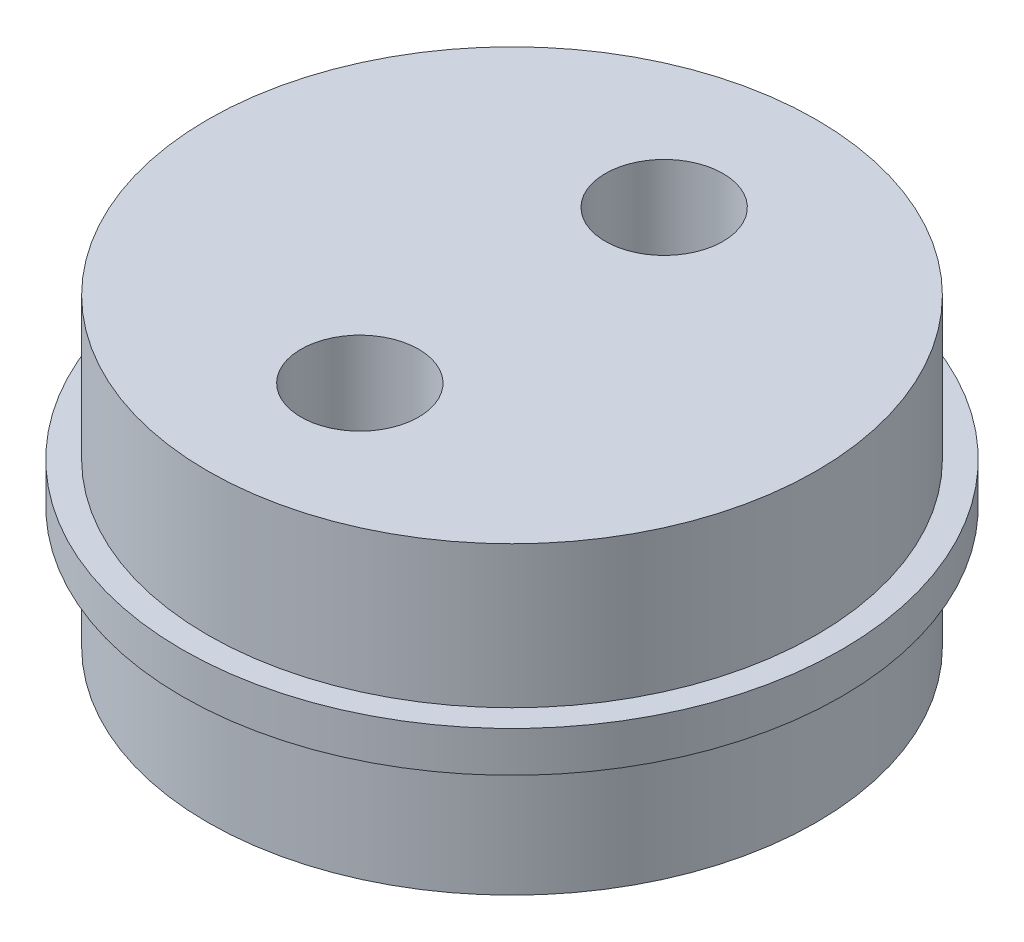
ISO-10303-21;
HEADER;
FILE_DESCRIPTION(('STEP AP214'),'2;1');
FILE_NAME('part.step','',(''),(''),'','','');
FILE_SCHEMA(('AUTOMOTIVE_DESIGN { 1 0 10303 214 1 1 1 1 }'));
ENDSEC;
DATA;
#1=APPLICATION_CONTEXT('core data for automotive mechanical design processes');
#2=APPLICATION_PROTOCOL_DEFINITION('international standard','automotive_design',2000,#1);
#3=PRODUCT_CONTEXT('',#1,'mechanical');
#4=PRODUCT('Part','Part','',(#3));
#5=PRODUCT_RELATED_PRODUCT_CATEGORY('part','',(#4));
#6=PRODUCT_DEFINITION_FORMATION('','',#4);
#7=PRODUCT_DEFINITION_CONTEXT('part definition',#1,'design');
#8=PRODUCT_DEFINITION('design','',#6,#7);
#9=PRODUCT_DEFINITION_SHAPE('','',#8);
#10=(LENGTH_UNIT() NAMED_UNIT(*) SI_UNIT(.MILLI.,.METRE.));
#11=(NAMED_UNIT(*) PLANE_ANGLE_UNIT() SI_UNIT($,.RADIAN.));
#12=(NAMED_UNIT(*) SI_UNIT($,.STERADIAN.) SOLID_ANGLE_UNIT());
#13=UNCERTAINTY_MEASURE_WITH_UNIT(LENGTH_MEASURE(1.E-05),#10,'distance_accuracy_value','');
#14=(GEOMETRIC_REPRESENTATION_CONTEXT(3) GLOBAL_UNCERTAINTY_ASSIGNED_CONTEXT((#13)) GLOBAL_UNIT_ASSIGNED_CONTEXT((#10,
#11,#12)) REPRESENTATION_CONTEXT('',''));
#15=CARTESIAN_POINT('',(0.,0.,0.));
#16=DIRECTION('',(0.,0.,1.));
#17=DIRECTION('',(1.,0.,0.));
#18=AXIS2_PLACEMENT_3D('',#15,#16,#17);
#19=CARTESIAN_POINT('',(0.,2.,0.));
#20=DIRECTION('',(0.,-1.,0.));
#21=DIRECTION('',(0.,0.,-1.));
#22=AXIS2_PLACEMENT_3D('',#19,#20,#21);
#23=CYLINDRICAL_SURFACE('',#22,16.25);
#24=CARTESIAN_POINT('',(0.,2.,0.));
#25=DIRECTION('',(0.,1.,0.));
#26=DIRECTION('',(0.,0.,1.));
#27=AXIS2_PLACEMENT_3D('',#24,#25,#26);
#28=CIRCLE('',#27,16.25);
#29=CARTESIAN_POINT('',(0.,2.,16.25));
#30=VERTEX_POINT('',#29);
#31=EDGE_CURVE('E57',#30,#30,#28,.T.);
#32=ORIENTED_EDGE('',*,*,#31,.F.);
#33=EDGE_LOOP('',(#32));
#34=FACE_BOUND('',#33,.T.);
#35=CARTESIAN_POINT('',(0.,0.,0.));
#36=DIRECTION('',(0.,1.,0.));
#37=DIRECTION('',(0.,0.,1.));
#38=AXIS2_PLACEMENT_3D('',#35,#36,#37);
#39=CIRCLE('',#38,16.25);
#40=CARTESIAN_POINT('',(0.,0.,16.25));
#41=VERTEX_POINT('',#40);
#42=EDGE_CURVE('E66',#41,#41,#39,.T.);
#43=ORIENTED_EDGE('',*,*,#42,.T.);
#44=EDGE_LOOP('',(#43));
#45=FACE_BOUND('',#44,.T.);
#46=ADVANCED_FACE('F43',(#34,#45),#23,.T.);
#47=CARTESIAN_POINT('',(0.,2.,0.));
#48=DIRECTION('',(0.,1.,0.));
#49=DIRECTION('',(0.,0.,1.));
#50=AXIS2_PLACEMENT_3D('',#47,#48,#49);
#51=PLANE('',#50);
#52=CARTESIAN_POINT('',(0.,2.,0.));
#53=DIRECTION('',(0.,1.,0.));
#54=DIRECTION('',(0.,0.,1.));
#55=AXIS2_PLACEMENT_3D('',#52,#53,#54);
#56=CIRCLE('',#55,15.);
#57=CARTESIAN_POINT('',(0.,2.,15.));
#58=VERTEX_POINT('',#57);
#59=EDGE_CURVE('E10',#58,#58,#56,.T.);
#60=ORIENTED_EDGE('',*,*,#59,.F.);
#61=EDGE_LOOP('',(#60));
#62=FACE_BOUND('',#61,.T.);
#63=ORIENTED_EDGE('',*,*,#31,.T.);
#64=EDGE_LOOP('',(#63));
#65=FACE_BOUND('',#64,.T.);
#66=ADVANCED_FACE('F128',(#62,#65),#51,.T.);
#67=CARTESIAN_POINT('',(0.,0.,0.));
#68=DIRECTION('',(0.,1.,0.));
#69=DIRECTION('',(0.,0.,1.));
#70=AXIS2_PLACEMENT_3D('',#67,#68,#69);
#71=PLANE('',#70);
#72=CARTESIAN_POINT('',(0.,0.,0.));
#73=DIRECTION('',(0.,-1.,0.));
#74=DIRECTION('',(0.,0.,-1.));
#75=AXIS2_PLACEMENT_3D('',#72,#73,#74);
#76=CIRCLE('',#75,15.);
#77=CARTESIAN_POINT('',(0.,0.,-15.));
#78=VERTEX_POINT('',#77);
#79=EDGE_CURVE('E51',#78,#78,#76,.T.);
#80=ORIENTED_EDGE('',*,*,#79,.F.);
#81=EDGE_LOOP('',(#80));
#82=FACE_BOUND('',#81,.T.);
#83=ORIENTED_EDGE('',*,*,#42,.F.);
#84=EDGE_LOOP('',(#83));
#85=FACE_BOUND('',#84,.T.);
#86=ADVANCED_FACE('F134',(#82,#85),#71,.F.);
#87=CARTESIAN_POINT('',(0.,-6.,0.));
#88=DIRECTION('',(0.,1.,0.));
#89=DIRECTION('',(0.,0.,1.));
#90=AXIS2_PLACEMENT_3D('',#87,#88,#89);
#91=CYLINDRICAL_SURFACE('',#90,15.);
#92=CARTESIAN_POINT('',(0.,-6.,0.));
#93=DIRECTION('',(0.,-1.,0.));
#94=DIRECTION('',(0.,0.,-1.));
#95=AXIS2_PLACEMENT_3D('',#92,#93,#94);
#96=CIRCLE('',#95,15.);
#97=CARTESIAN_POINT('',(0.,-6.,-15.));
#98=VERTEX_POINT('',#97);
#99=EDGE_CURVE('E63',#98,#98,#96,.T.);
#100=ORIENTED_EDGE('',*,*,#99,.F.);
#101=EDGE_LOOP('',(#100));
#102=FACE_BOUND('',#101,.T.);
#103=ORIENTED_EDGE('',*,*,#79,.T.);
#104=EDGE_LOOP('',(#103));
#105=FACE_BOUND('',#104,.T.);
#106=ADVANCED_FACE('F141',(#102,#105),#91,.T.);
#107=CARTESIAN_POINT('',(0.,-6.,0.));
#108=DIRECTION('',(0.,-1.,0.));
#109=DIRECTION('',(0.,0.,-1.));
#110=AXIS2_PLACEMENT_3D('',#107,#108,#109);
#111=PLANE('',#110);
#112=CARTESIAN_POINT('',(0.,-6.,-7.5));
#113=DIRECTION('',(0.,1.,0.));
#114=DIRECTION('',(0.,0.,1.));
#115=AXIS2_PLACEMENT_3D('',#112,#113,#114);
#116=CIRCLE('',#115,2.2);
#117=CARTESIAN_POINT('',(0.,-6.,-5.3));
#118=VERTEX_POINT('',#117);
#119=EDGE_CURVE('E85',#118,#118,#116,.T.);
#120=ORIENTED_EDGE('',*,*,#119,.T.);
#121=EDGE_LOOP('',(#120));
#122=FACE_BOUND('',#121,.T.);
#123=CARTESIAN_POINT('',(0.,-6.,7.5));
#124=DIRECTION('',(0.,1.,0.));
#125=DIRECTION('',(0.,0.,1.));
#126=AXIS2_PLACEMENT_3D('',#123,#124,#125);
#127=CIRCLE('',#126,2.2);
#128=CARTESIAN_POINT('',(0.,-6.,9.7));
#129=VERTEX_POINT('',#128);
#130=EDGE_CURVE('E93',#129,#129,#127,.T.);
#131=ORIENTED_EDGE('',*,*,#130,.T.);
#132=EDGE_LOOP('',(#131));
#133=FACE_BOUND('',#132,.T.);
#134=ORIENTED_EDGE('',*,*,#99,.T.);
#135=EDGE_LOOP('',(#134));
#136=FACE_BOUND('',#135,.T.);
#137=ADVANCED_FACE('F146',(#122,#133,#136),#111,.T.);
#138=CARTESIAN_POINT('',(0.,9.,0.));
#139=DIRECTION('',(0.,-1.,0.));
#140=DIRECTION('',(0.,0.,-1.));
#141=AXIS2_PLACEMENT_3D('',#138,#139,#140);
#142=CYLINDRICAL_SURFACE('',#141,15.);
#143=CARTESIAN_POINT('',(0.,9.,0.));
#144=DIRECTION('',(0.,1.,0.));
#145=DIRECTION('',(0.,0.,1.));
#146=AXIS2_PLACEMENT_3D('',#143,#144,#145);
#147=CIRCLE('',#146,15.);
#148=CARTESIAN_POINT('',(0.,9.,15.));
#149=VERTEX_POINT('',#148);
#150=EDGE_CURVE('E61',#149,#149,#147,.T.);
#151=ORIENTED_EDGE('',*,*,#150,.F.);
#152=EDGE_LOOP('',(#151));
#153=FACE_BOUND('',#152,.T.);
#154=ORIENTED_EDGE('',*,*,#59,.T.);
#155=EDGE_LOOP('',(#154));
#156=FACE_BOUND('',#155,.T.);
#157=ADVANCED_FACE('F122',(#153,#156),#142,.T.);
#158=CARTESIAN_POINT('',(0.,9.,0.));
#159=DIRECTION('',(0.,1.,0.));
#160=DIRECTION('',(0.,0.,1.));
#161=AXIS2_PLACEMENT_3D('',#158,#159,#160);
#162=PLANE('',#161);
#163=CARTESIAN_POINT('',(0.,9.,-7.5));
#164=DIRECTION('',(0.,1.,0.));
#165=DIRECTION('',(0.,0.,1.));
#166=AXIS2_PLACEMENT_3D('',#163,#164,#165);
#167=CIRCLE('',#166,2.9);
#168=CARTESIAN_POINT('',(0.,9.,-10.4));
#169=VERTEX_POINT('',#168);
#170=EDGE_CURVE('E78',#169,#169,#167,.F.);
#171=ORIENTED_EDGE('',*,*,#170,.T.);
#172=EDGE_LOOP('',(#171));
#173=FACE_BOUND('',#172,.T.);
#174=CARTESIAN_POINT('',(0.,9.,7.5));
#175=DIRECTION('',(0.,1.,0.));
#176=DIRECTION('',(0.,0.,1.));
#177=AXIS2_PLACEMENT_3D('',#174,#175,#176);
#178=CIRCLE('',#177,2.9);
#179=CARTESIAN_POINT('',(0.,9.,4.6));
#180=VERTEX_POINT('',#179);
#181=EDGE_CURVE('E74',#180,#180,#178,.F.);
#182=ORIENTED_EDGE('',*,*,#181,.T.);
#183=EDGE_LOOP('',(#182));
#184=FACE_BOUND('',#183,.T.);
#185=ORIENTED_EDGE('',*,*,#150,.T.);
#186=EDGE_LOOP('',(#185));
#187=FACE_BOUND('',#186,.T.);
#188=ADVANCED_FACE('F111',(#173,#184,#187),#162,.T.);
#189=CARTESIAN_POINT('',(0.,9.000012,7.5));
#190=DIRECTION('',(0.,-1.,0.));
#191=DIRECTION('',(0.,0.,-1.));
#192=AXIS2_PLACEMENT_3D('',#189,#190,#191);
#193=CYLINDRICAL_SURFACE('',#192,2.9);
#194=CARTESIAN_POINT('',(0.,1.,7.5));
#195=DIRECTION('',(0.,1.,0.));
#196=DIRECTION('',(0.,0.,-1.));
#197=AXIS2_PLACEMENT_3D('',#194,#195,#196);
#198=CIRCLE('',#197,2.9);
#199=CARTESIAN_POINT('',(0.,0.999999999999999,4.6));
#200=VERTEX_POINT('',#199);
#201=EDGE_CURVE('E91',#200,#200,#198,.T.);
#202=CARTESIAN_POINT('',(0.,9.,4.6));
#203=CARTESIAN_POINT('',(0.,8.91666666666667,4.6));
#204=CARTESIAN_POINT('',(0.,8.83333333333333,4.6));
#205=CARTESIAN_POINT('',(0.,8.66666666666667,4.6));
#206=CARTESIAN_POINT('',(0.,8.58333333333333,4.6));
#207=CARTESIAN_POINT('',(0.,8.41666666666667,4.6));
#208=CARTESIAN_POINT('',(0.,8.33333333333333,4.6));
#209=CARTESIAN_POINT('',(0.,8.16666666666667,4.6));
#210=CARTESIAN_POINT('',(0.,8.08333333333333,4.6));
#211=CARTESIAN_POINT('',(0.,7.91666666666667,4.6));
#212=CARTESIAN_POINT('',(0.,7.83333333333333,4.6));
#213=CARTESIAN_POINT('',(0.,7.66666666666667,4.6));
#214=CARTESIAN_POINT('',(0.,7.58333333333333,4.6));
#215=CARTESIAN_POINT('',(0.,7.41666666666667,4.6));
#216=CARTESIAN_POINT('',(0.,7.33333333333333,4.6));
#217=CARTESIAN_POINT('',(0.,7.16666666666667,4.6));
#218=CARTESIAN_POINT('',(0.,7.08333333333333,4.6));
#219=CARTESIAN_POINT('',(0.,6.91666666666667,4.6));
#220=CARTESIAN_POINT('',(0.,6.83333333333333,4.6));
#221=CARTESIAN_POINT('',(0.,6.66666666666667,4.6));
#222=CARTESIAN_POINT('',(0.,6.58333333333333,4.6));
#223=CARTESIAN_POINT('',(0.,6.41666666666667,4.6));
#224=CARTESIAN_POINT('',(0.,6.33333333333333,4.6));
#225=CARTESIAN_POINT('',(0.,6.16666666666667,4.6));
#226=CARTESIAN_POINT('',(0.,6.08333333333333,4.6));
#227=CARTESIAN_POINT('',(0.,5.91666666666667,4.6));
#228=CARTESIAN_POINT('',(0.,5.83333333333333,4.6));
#229=CARTESIAN_POINT('',(0.,5.66666666666667,4.6));
#230=CARTESIAN_POINT('',(0.,5.58333333333333,4.6));
#231=CARTESIAN_POINT('',(0.,5.41666666666667,4.6));
#232=CARTESIAN_POINT('',(0.,5.33333333333333,4.6));
#233=CARTESIAN_POINT('',(0.,5.16666666666667,4.6));
#234=CARTESIAN_POINT('',(0.,5.08333333333333,4.6));
#235=CARTESIAN_POINT('',(0.,4.91666666666667,4.6));
#236=CARTESIAN_POINT('',(0.,4.83333333333333,4.6));
#237=CARTESIAN_POINT('',(0.,4.66666666666667,4.6));
#238=CARTESIAN_POINT('',(0.,4.58333333333333,4.6));
#239=CARTESIAN_POINT('',(0.,4.41666666666667,4.6));
#240=CARTESIAN_POINT('',(0.,4.33333333333333,4.6));
#241=CARTESIAN_POINT('',(0.,4.16666666666667,4.6));
#242=CARTESIAN_POINT('',(0.,4.08333333333333,4.6));
#243=CARTESIAN_POINT('',(0.,3.91666666666667,4.6));
#244=CARTESIAN_POINT('',(0.,3.83333333333333,4.6));
#245=CARTESIAN_POINT('',(0.,3.66666666666667,4.6));
#246=CARTESIAN_POINT('',(0.,3.58333333333333,4.6));
#247=CARTESIAN_POINT('',(0.,3.41666666666667,4.6));
#248=CARTESIAN_POINT('',(0.,3.33333333333333,4.6));
#249=CARTESIAN_POINT('',(0.,3.16666666666667,4.6));
#250=CARTESIAN_POINT('',(0.,3.08333333333333,4.6));
#251=CARTESIAN_POINT('',(0.,2.91666666666667,4.6));
#252=CARTESIAN_POINT('',(0.,2.83333333333333,4.6));
#253=CARTESIAN_POINT('',(0.,2.66666666666667,4.6));
#254=CARTESIAN_POINT('',(0.,2.58333333333333,4.6));
#255=CARTESIAN_POINT('',(0.,2.41666666666667,4.6));
#256=CARTESIAN_POINT('',(0.,2.33333333333333,4.6));
#257=CARTESIAN_POINT('',(0.,2.16666666666667,4.6));
#258=CARTESIAN_POINT('',(0.,2.08333333333333,4.6));
#259=CARTESIAN_POINT('',(0.,1.91666666666667,4.6));
#260=CARTESIAN_POINT('',(0.,1.83333333333333,4.6));
#261=CARTESIAN_POINT('',(0.,1.66666666666667,4.6));
#262=CARTESIAN_POINT('',(0.,1.58333333333333,4.6));
#263=CARTESIAN_POINT('',(0.,1.41666666666667,4.6));
#264=CARTESIAN_POINT('',(0.,1.33333333333333,4.6));
#265=CARTESIAN_POINT('',(0.,1.16666666666667,4.6));
#266=CARTESIAN_POINT('',(0.,1.08333333333333,4.6));
#267=CARTESIAN_POINT('',(0.,0.999999999999999,4.6));
#268=B_SPLINE_CURVE_WITH_KNOTS('',3,(#202,#203,#204,#205,#206,#207,#208,#209,#210,#211,#212,
#213,#214,#215,#216,#217,#218,#219,#220,#221,#222,#223,#224,#225,#226,#227,#228,#229,#230,#231,
#232,#233,#234,#235,#236,#237,#238,#239,#240,#241,#242,#243,#244,#245,#246,#247,#248,#249,#250,
#251,#252,#253,#254,#255,#256,#257,#258,#259,#260,#261,#262,#263,#264,#265,#266,#267),
.UNSPECIFIED.,.F.,.F.,(4,2,2,2,2,2,2,2,2,2,2,2,2,2,2,2,2,2,2,2,2,2,2,2,2,2,2,2,2,2,2,2,4),(0.,
0.249999999999999,0.499999999999999,0.749999999999999,0.999999999999999,1.25,1.5,1.75,2.,2.25,
2.5,2.75,3.,3.25,3.5,3.75,4.,4.25,4.5,4.75,5.,5.25,5.5,5.75,6.,6.25,6.5,6.75,7.,7.25,7.5,7.75,
8.),.UNSPECIFIED.);
#269=EDGE_CURVE('BSEAM109',#180,#200,#268,.T.);
#270=ORIENTED_EDGE('',*,*,#181,.F.);
#271=ORIENTED_EDGE('',*,*,#201,.F.);
#272=ORIENTED_EDGE('',*,*,#269,.T.);
#273=ORIENTED_EDGE('',*,*,#269,.F.);
#274=EDGE_LOOP('',(#270,#272,#271,#273));
#275=FACE_BOUND('',#274,.T.);
#276=ADVANCED_FACE('F109',(#275),#193,.F.);
#277=CARTESIAN_POINT('',(0.,1.,7.5));
#278=DIRECTION('',(0.,-1.,0.));
#279=DIRECTION('',(0.,0.,-1.));
#280=AXIS2_PLACEMENT_3D('',#277,#278,#279);
#281=PLANE('',#280);
#282=CARTESIAN_POINT('',(0.,1.,7.5));
#283=DIRECTION('',(0.,-1.,0.));
#284=DIRECTION('',(0.,0.,-1.));
#285=AXIS2_PLACEMENT_3D('',#282,#283,#284);
#286=CIRCLE('',#285,2.2);
#287=CARTESIAN_POINT('',(0.,1.,5.3));
#288=VERTEX_POINT('',#287);
#289=EDGE_CURVE('E46',#288,#288,#286,.T.);
#290=ORIENTED_EDGE('',*,*,#289,.T.);
#291=EDGE_LOOP('',(#290));
#292=FACE_BOUND('',#291,.T.);
#293=ORIENTED_EDGE('',*,*,#201,.T.);
#294=EDGE_LOOP('',(#293));
#295=FACE_BOUND('',#294,.T.);
#296=ADVANCED_FACE('F107',(#292,#295),#281,.F.);
#297=CARTESIAN_POINT('',(0.,9.000012,-7.5));
#298=DIRECTION('',(0.,-1.,0.));
#299=DIRECTION('',(0.,0.,-1.));
#300=AXIS2_PLACEMENT_3D('',#297,#298,#299);
#301=CYLINDRICAL_SURFACE('',#300,2.9);
#302=CARTESIAN_POINT('',(0.,1.,-7.5));
#303=DIRECTION('',(0.,1.,0.));
#304=DIRECTION('',(0.,0.,1.));
#305=AXIS2_PLACEMENT_3D('',#302,#303,#304);
#306=CIRCLE('',#305,2.9);
#307=CARTESIAN_POINT('',(0.,0.999999999999999,-10.4));
#308=VERTEX_POINT('',#307);
#309=EDGE_CURVE('E79',#308,#308,#306,.T.);
#310=CARTESIAN_POINT('',(0.,9.,-10.4));
#311=CARTESIAN_POINT('',(0.,8.91666666666667,-10.4));
#312=CARTESIAN_POINT('',(0.,8.83333333333333,-10.4));
#313=CARTESIAN_POINT('',(0.,8.66666666666667,-10.4));
#314=CARTESIAN_POINT('',(0.,8.58333333333333,-10.4));
#315=CARTESIAN_POINT('',(0.,8.41666666666667,-10.4));
#316=CARTESIAN_POINT('',(0.,8.33333333333333,-10.4));
#317=CARTESIAN_POINT('',(0.,8.16666666666667,-10.4));
#318=CARTESIAN_POINT('',(0.,8.08333333333333,-10.4));
#319=CARTESIAN_POINT('',(0.,7.91666666666667,-10.4));
#320=CARTESIAN_POINT('',(0.,7.83333333333333,-10.4));
#321=CARTESIAN_POINT('',(0.,7.66666666666667,-10.4));
#322=CARTESIAN_POINT('',(0.,7.58333333333333,-10.4));
#323=CARTESIAN_POINT('',(0.,7.41666666666667,-10.4));
#324=CARTESIAN_POINT('',(0.,7.33333333333333,-10.4));
#325=CARTESIAN_POINT('',(0.,7.16666666666667,-10.4));
#326=CARTESIAN_POINT('',(0.,7.08333333333333,-10.4));
#327=CARTESIAN_POINT('',(0.,6.91666666666667,-10.4));
#328=CARTESIAN_POINT('',(0.,6.83333333333333,-10.4));
#329=CARTESIAN_POINT('',(0.,6.66666666666667,-10.4));
#330=CARTESIAN_POINT('',(0.,6.58333333333333,-10.4));
#331=CARTESIAN_POINT('',(0.,6.41666666666667,-10.4));
#332=CARTESIAN_POINT('',(0.,6.33333333333333,-10.4));
#333=CARTESIAN_POINT('',(0.,6.16666666666667,-10.4));
#334=CARTESIAN_POINT('',(0.,6.08333333333333,-10.4));
#335=CARTESIAN_POINT('',(0.,5.91666666666667,-10.4));
#336=CARTESIAN_POINT('',(0.,5.83333333333333,-10.4));
#337=CARTESIAN_POINT('',(0.,5.66666666666667,-10.4));
#338=CARTESIAN_POINT('',(0.,5.58333333333333,-10.4));
#339=CARTESIAN_POINT('',(0.,5.41666666666667,-10.4));
#340=CARTESIAN_POINT('',(0.,5.33333333333333,-10.4));
#341=CARTESIAN_POINT('',(0.,5.16666666666667,-10.4));
#342=CARTESIAN_POINT('',(0.,5.08333333333333,-10.4));
#343=CARTESIAN_POINT('',(0.,4.91666666666667,-10.4));
#344=CARTESIAN_POINT('',(0.,4.83333333333333,-10.4));
#345=CARTESIAN_POINT('',(0.,4.66666666666667,-10.4));
#346=CARTESIAN_POINT('',(0.,4.58333333333333,-10.4));
#347=CARTESIAN_POINT('',(0.,4.41666666666667,-10.4));
#348=CARTESIAN_POINT('',(0.,4.33333333333333,-10.4));
#349=CARTESIAN_POINT('',(0.,4.16666666666667,-10.4));
#350=CARTESIAN_POINT('',(0.,4.08333333333333,-10.4));
#351=CARTESIAN_POINT('',(0.,3.91666666666667,-10.4));
#352=CARTESIAN_POINT('',(0.,3.83333333333333,-10.4));
#353=CARTESIAN_POINT('',(0.,3.66666666666667,-10.4));
#354=CARTESIAN_POINT('',(0.,3.58333333333333,-10.4));
#355=CARTESIAN_POINT('',(0.,3.41666666666667,-10.4));
#356=CARTESIAN_POINT('',(0.,3.33333333333333,-10.4));
#357=CARTESIAN_POINT('',(0.,3.16666666666667,-10.4));
#358=CARTESIAN_POINT('',(0.,3.08333333333333,-10.4));
#359=CARTESIAN_POINT('',(0.,2.91666666666667,-10.4));
#360=CARTESIAN_POINT('',(0.,2.83333333333333,-10.4));
#361=CARTESIAN_POINT('',(0.,2.66666666666667,-10.4));
#362=CARTESIAN_POINT('',(0.,2.58333333333333,-10.4));
#363=CARTESIAN_POINT('',(0.,2.41666666666667,-10.4));
#364=CARTESIAN_POINT('',(0.,2.33333333333333,-10.4));
#365=CARTESIAN_POINT('',(0.,2.16666666666667,-10.4));
#366=CARTESIAN_POINT('',(0.,2.08333333333333,-10.4));
#367=CARTESIAN_POINT('',(0.,1.91666666666667,-10.4));
#368=CARTESIAN_POINT('',(0.,1.83333333333333,-10.4));
#369=CARTESIAN_POINT('',(0.,1.66666666666667,-10.4));
#370=CARTESIAN_POINT('',(0.,1.58333333333333,-10.4));
#371=CARTESIAN_POINT('',(0.,1.41666666666667,-10.4));
#372=CARTESIAN_POINT('',(0.,1.33333333333333,-10.4));
#373=CARTESIAN_POINT('',(0.,1.16666666666667,-10.4));
#374=CARTESIAN_POINT('',(0.,1.08333333333333,-10.4));
#375=CARTESIAN_POINT('',(0.,0.999999999999999,-10.4));
#376=B_SPLINE_CURVE_WITH_KNOTS('',3,(#310,#311,#312,#313,#314,#315,#316,#317,#318,#319,#320,
#321,#322,#323,#324,#325,#326,#327,#328,#329,#330,#331,#332,#333,#334,#335,#336,#337,#338,#339,
#340,#341,#342,#343,#344,#345,#346,#347,#348,#349,#350,#351,#352,#353,#354,#355,#356,#357,#358,
#359,#360,#361,#362,#363,#364,#365,#366,#367,#368,#369,#370,#371,#372,#373,#374,#375),
.UNSPECIFIED.,.F.,.F.,(4,2,2,2,2,2,2,2,2,2,2,2,2,2,2,2,2,2,2,2,2,2,2,2,2,2,2,2,2,2,2,2,4),(0.,
0.249999999999999,0.499999999999999,0.749999999999999,0.999999999999999,1.25,1.5,1.75,2.,2.25,
2.5,2.75,3.,3.25,3.5,3.75,4.,4.25,4.5,4.75,5.,5.25,5.5,5.75,6.,6.25,6.5,6.75,7.,7.25,7.5,7.75,
8.),.UNSPECIFIED.);
#377=EDGE_CURVE('BSEAM119',#169,#308,#376,.T.);
#378=ORIENTED_EDGE('',*,*,#170,.F.);
#379=ORIENTED_EDGE('',*,*,#309,.F.);
#380=ORIENTED_EDGE('',*,*,#377,.T.);
#381=ORIENTED_EDGE('',*,*,#377,.F.);
#382=EDGE_LOOP('',(#378,#380,#379,#381));
#383=FACE_BOUND('',#382,.T.);
#384=ADVANCED_FACE('F119',(#383),#301,.F.);
#385=CARTESIAN_POINT('',(0.,1.,-7.5));
#386=DIRECTION('',(0.,1.,0.));
#387=DIRECTION('',(0.,0.,1.));
#388=AXIS2_PLACEMENT_3D('',#385,#386,#387);
#389=PLANE('',#388);
#390=CARTESIAN_POINT('',(0.,1.,-7.5));
#391=DIRECTION('',(0.,1.,0.));
#392=DIRECTION('',(0.,0.,1.));
#393=AXIS2_PLACEMENT_3D('',#390,#391,#392);
#394=CIRCLE('',#393,2.2);
#395=CARTESIAN_POINT('',(0.,1.,-5.3));
#396=VERTEX_POINT('',#395);
#397=EDGE_CURVE('E82',#396,#396,#394,.T.);
#398=ORIENTED_EDGE('',*,*,#397,.F.);
#399=EDGE_LOOP('',(#398));
#400=FACE_BOUND('',#399,.T.);
#401=ORIENTED_EDGE('',*,*,#309,.T.);
#402=EDGE_LOOP('',(#401));
#403=FACE_BOUND('',#402,.T.);
#404=ADVANCED_FACE('F189',(#400,#403),#389,.T.);
#405=CARTESIAN_POINT('',(0.,-6.,-7.5));
#406=DIRECTION('',(0.,1.,0.));
#407=DIRECTION('',(0.,0.,1.));
#408=AXIS2_PLACEMENT_3D('',#405,#406,#407);
#409=CYLINDRICAL_SURFACE('',#408,2.2);
#410=ORIENTED_EDGE('',*,*,#397,.T.);
#411=EDGE_LOOP('',(#410));
#412=FACE_BOUND('',#411,.T.);
#413=ORIENTED_EDGE('',*,*,#119,.F.);
#414=EDGE_LOOP('',(#413));
#415=FACE_BOUND('',#414,.T.);
#416=ADVANCED_FACE('F197',(#412,#415),#409,.F.);
#417=CARTESIAN_POINT('',(0.,-6.,7.5));
#418=DIRECTION('',(0.,1.,0.));
#419=DIRECTION('',(0.,0.,1.));
#420=AXIS2_PLACEMENT_3D('',#417,#418,#419);
#421=CYLINDRICAL_SURFACE('',#420,2.2);
#422=ORIENTED_EDGE('',*,*,#130,.F.);
#423=EDGE_LOOP('',(#422));
#424=FACE_BOUND('',#423,.T.);
#425=ORIENTED_EDGE('',*,*,#289,.F.);
#426=EDGE_LOOP('',(#425));
#427=FACE_BOUND('',#426,.T.);
#428=ADVANCED_FACE('F207',(#424,#427),#421,.F.);
#429=CLOSED_SHELL('',(#46,#66,#86,#106,#137,#157,#188,#276,#296,#384,#404,#416,#428));
#430=MANIFOLD_SOLID_BREP('B2',#429);
#431=ADVANCED_BREP_SHAPE_REPRESENTATION('',(#18,#430),#14);
#432=SHAPE_DEFINITION_REPRESENTATION(#9,#431);
ENDSEC;
END-ISO-10303-21;
